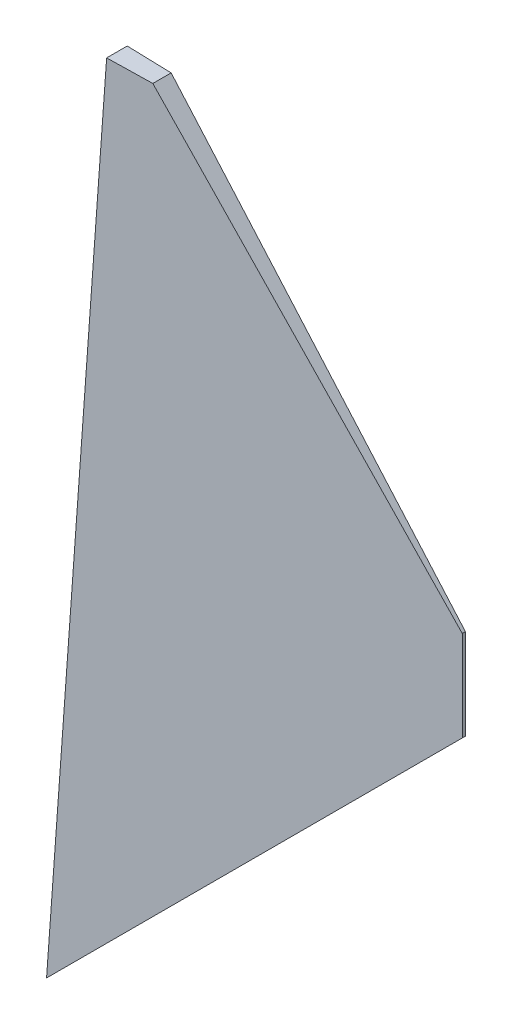
ISO-10303-21;
HEADER;
FILE_DESCRIPTION(('STEP AP214'),'2;1');
FILE_NAME('part.step','',(''),(''),'','','');
FILE_SCHEMA(('AUTOMOTIVE_DESIGN { 1 0 10303 214 1 1 1 1 }'));
ENDSEC;
DATA;
#1=APPLICATION_CONTEXT('core data for automotive mechanical design processes');
#2=APPLICATION_PROTOCOL_DEFINITION('international standard','automotive_design',2000,#1);
#3=PRODUCT_CONTEXT('',#1,'mechanical');
#4=PRODUCT('Part','Part','',(#3));
#5=PRODUCT_RELATED_PRODUCT_CATEGORY('part','',(#4));
#6=PRODUCT_DEFINITION_FORMATION('','',#4);
#7=PRODUCT_DEFINITION_CONTEXT('part definition',#1,'design');
#8=PRODUCT_DEFINITION('design','',#6,#7);
#9=PRODUCT_DEFINITION_SHAPE('','',#8);
#10=(LENGTH_UNIT() NAMED_UNIT(*) SI_UNIT(.MILLI.,.METRE.));
#11=(NAMED_UNIT(*) PLANE_ANGLE_UNIT() SI_UNIT($,.RADIAN.));
#12=(NAMED_UNIT(*) SI_UNIT($,.STERADIAN.) SOLID_ANGLE_UNIT());
#13=UNCERTAINTY_MEASURE_WITH_UNIT(LENGTH_MEASURE(1.E-05),#10,'distance_accuracy_value','');
#14=(GEOMETRIC_REPRESENTATION_CONTEXT(3) GLOBAL_UNCERTAINTY_ASSIGNED_CONTEXT((#13)) GLOBAL_UNIT_ASSIGNED_CONTEXT((#10,
#11,#12)) REPRESENTATION_CONTEXT('',''));
#15=CARTESIAN_POINT('',(0.,0.,0.));
#16=DIRECTION('',(0.,0.,1.));
#17=DIRECTION('',(1.,0.,0.));
#18=AXIS2_PLACEMENT_3D('',#15,#16,#17);
#19=CARTESIAN_POINT('',(228.6,508.,-0.888806717752921));
#20=DIRECTION('',(-0.0211064082934383,0.,-0.999777234952342));
#21=DIRECTION('',(-0.999777234952342,0.,0.0211064082934383));
#22=AXIS2_PLACEMENT_3D('',#19,#20,#21);
#23=PLANE('',#22);
#24=DIRECTION('',(0.678502784173109,-0.734458165175256,-0.0143239476658767));
#25=VECTOR('',#24,1.);
#26=CARTESIAN_POINT('',(114.681325389983,402.71342285535,1.51614307956966));
#27=LINE('',#26,#25);
#28=CARTESIAN_POINT('',(58.4369807585741,463.596176947233,2.70352368845496));
#29=VERTEX_POINT('',#28);
#30=CARTESIAN_POINT('',(228.6,279.400000000001,-0.88880671775292));
#31=VERTEX_POINT('',#30);
#32=EDGE_CURVE('E175',#29,#31,#27,.T.);
#33=ORIENTED_EDGE('',*,*,#32,.F.);
#34=DIRECTION('',(0.999777234952342,0.,-0.0211064082934383));
#35=VECTOR('',#34,1.);
#36=CARTESIAN_POINT('',(228.6,463.596176947233,-0.888806717752923));
#37=LINE('',#36,#35);
#38=CARTESIAN_POINT('',(33.0369807585741,463.596176947233,3.23974591067718));
#39=VERTEX_POINT('',#38);
#40=EDGE_CURVE('E150',#39,#29,#37,.T.);
#41=ORIENTED_EDGE('',*,*,#40,.F.);
#42=DIRECTION('',(0.0710820690227971,0.997469341683583,-0.00150062145714794));
#43=VECTOR('',#42,1.);
#44=CARTESIAN_POINT('',(37.1738627485292,521.647567570371,3.15241173533368));
#45=LINE('',#44,#43);
#46=CARTESIAN_POINT('',(0.,0.,3.93719328224708));
#47=VERTEX_POINT('',#46);
#48=EDGE_CURVE('E138',#47,#39,#45,.T.);
#49=ORIENTED_EDGE('',*,*,#48,.F.);
#50=DIRECTION('',(-0.707028008688555,-0.707028008688558,0.0149261468500917));
#51=VECTOR('',#50,1.);
#52=CARTESIAN_POINT('',(368.268876256587,368.268876256588,-3.83737188316975));
#53=LINE('',#52,#51);
#54=CARTESIAN_POINT('',(228.6,228.600000000001,-0.88880671775292));
#55=VERTEX_POINT('',#54);
#56=EDGE_CURVE('E144',#55,#47,#53,.T.);
#57=ORIENTED_EDGE('',*,*,#56,.F.);
#58=DIRECTION('',(0.,-1.,0.));
#59=VECTOR('',#58,1.);
#60=CARTESIAN_POINT('',(228.6,508.,-0.888806717752921));
#61=LINE('',#60,#59);
#62=EDGE_CURVE('E100',#31,#55,#61,.T.);
#63=ORIENTED_EDGE('',*,*,#62,.F.);
#64=EDGE_LOOP('',(#33,#41,#49,#57,#63));
#65=FACE_BOUND('',#64,.T.);
#66=ADVANCED_FACE('F86',(#65),#23,.F.);
#67=CARTESIAN_POINT('',(228.6,508.,-2.66680671775292));
#68=DIRECTION('',(-1.,0.,0.));
#69=DIRECTION('',(0.,0.,1.));
#70=AXIS2_PLACEMENT_3D('',#67,#68,#69);
#71=PLANE('',#70);
#72=DIRECTION('',(0.,0.,1.));
#73=VECTOR('',#72,1.);
#74=CARTESIAN_POINT('',(228.6,279.400000000001,-9.27080671775292));
#75=LINE('',#74,#73);
#76=CARTESIAN_POINT('',(228.6,279.400000000001,-2.66680671775292));
#77=VERTEX_POINT('',#76);
#78=EDGE_CURVE('E171',#77,#31,#75,.T.);
#79=ORIENTED_EDGE('',*,*,#78,.T.);
#80=ORIENTED_EDGE('',*,*,#62,.T.);
#81=DIRECTION('',(0.,0.,1.));
#82=VECTOR('',#81,1.);
#83=CARTESIAN_POINT('',(228.6,228.600000000001,-9.27080671775292));
#84=LINE('',#83,#82);
#85=CARTESIAN_POINT('',(228.6,228.600000000001,-2.66680671775292));
#86=VERTEX_POINT('',#85);
#87=EDGE_CURVE('E153',#86,#55,#84,.T.);
#88=ORIENTED_EDGE('',*,*,#87,.F.);
#89=DIRECTION('',(0.,-1.,0.));
#90=VECTOR('',#89,1.);
#91=CARTESIAN_POINT('',(228.6,508.,-2.66680671775292));
#92=LINE('',#91,#90);
#93=EDGE_CURVE('E108',#77,#86,#92,.T.);
#94=ORIENTED_EDGE('',*,*,#93,.F.);
#95=EDGE_LOOP('',(#79,#80,#88,#94));
#96=FACE_BOUND('',#95,.T.);
#97=ADVANCED_FACE('F178',(#96),#71,.F.);
#98=CARTESIAN_POINT('',(0.,508.,-9.27080671775292));
#99=DIRECTION('',(-0.028876841559416,0.,0.999582977056709));
#100=DIRECTION('',(0.999582977056709,0.,0.028876841559416));
#101=AXIS2_PLACEMENT_3D('',#98,#99,#100);
#102=PLANE('',#101);
#103=DIRECTION('',(-0.678442055732126,0.734392428526301,-0.0195994371655948));
#104=VECTOR('',#103,1.);
#105=CARTESIAN_POINT('',(9.39306659303715,516.684688964072,-8.99945146062074));
#106=LINE('',#105,#104);
#107=CARTESIAN_POINT('',(58.4369807585741,463.596176947233,-7.58262727361634));
#108=VERTEX_POINT('',#107);
#109=EDGE_CURVE('E12',#77,#108,#106,.T.);
#110=ORIENTED_EDGE('',*,*,#109,.F.);
#111=ORIENTED_EDGE('',*,*,#93,.T.);
#112=DIRECTION('',(0.706959295187016,0.706959295187019,0.0204232685276249));
#113=VECTOR('',#112,1.);
#114=CARTESIAN_POINT('',(253.894054086073,253.894054086074,-1.93608959971082));
#115=LINE('',#114,#113);
#116=CARTESIAN_POINT('',(0.,0.,-9.27080671775292));
#117=VERTEX_POINT('',#116);
#118=EDGE_CURVE('E154',#117,#86,#115,.T.);
#119=ORIENTED_EDGE('',*,*,#118,.F.);
#120=DIRECTION('',(-0.0710819991874846,-0.997468361709531,-0.00205347997652733));
#121=VECTOR('',#120,1.);
#122=CARTESIAN_POINT('',(36.0182390005019,505.43111136664,-8.23027981329398));
#123=LINE('',#122,#121);
#124=CARTESIAN_POINT('',(33.0369807585741,463.596176947233,-8.31640505139411));
#125=VERTEX_POINT('',#124);
#126=EDGE_CURVE('E141',#125,#117,#123,.T.);
#127=ORIENTED_EDGE('',*,*,#126,.F.);
#128=DIRECTION('',(-0.999582977056709,0.,-0.028876841559416));
#129=VECTOR('',#128,1.);
#130=CARTESIAN_POINT('',(0.,463.596176947233,-9.27080671775292));
#131=LINE('',#130,#129);
#132=EDGE_CURVE('E93',#108,#125,#131,.T.);
#133=ORIENTED_EDGE('',*,*,#132,.F.);
#134=EDGE_LOOP('',(#110,#111,#119,#127,#133));
#135=FACE_BOUND('',#134,.T.);
#136=ADVANCED_FACE('F168',(#135),#102,.F.);
#137=CARTESIAN_POINT('',(0.,0.,-9.27080671775292));
#138=DIRECTION('',(0.707106781186549,-0.707106781186546,0.));
#139=DIRECTION('',(0.707106781186546,0.707106781186549,0.));
#140=AXIS2_PLACEMENT_3D('',#137,#138,#139);
#141=PLANE('',#140);
#142=ORIENTED_EDGE('',*,*,#56,.T.);
#143=DIRECTION('',(0.,0.,1.));
#144=VECTOR('',#143,1.);
#145=CARTESIAN_POINT('',(0.,0.,3.93719328224708));
#146=LINE('',#145,#144);
#147=EDGE_CURVE('E134',#117,#47,#146,.T.);
#148=ORIENTED_EDGE('',*,*,#147,.F.);
#149=ORIENTED_EDGE('',*,*,#118,.T.);
#150=ORIENTED_EDGE('',*,*,#87,.T.);
#151=EDGE_LOOP('',(#142,#148,#149,#150));
#152=FACE_BOUND('',#151,.T.);
#153=ADVANCED_FACE('F152',(#152),#141,.T.);
#154=CARTESIAN_POINT('',(262.601237823977,242.594717356511,-9.27080671775292));
#155=DIRECTION('',(0.734533523173756,0.678572400952139,0.));
#156=DIRECTION('',(-0.678572400952139,0.734533523173756,0.));
#157=AXIS2_PLACEMENT_3D('',#154,#155,#156);
#158=PLANE('',#157);
#159=ORIENTED_EDGE('',*,*,#32,.T.);
#160=ORIENTED_EDGE('',*,*,#78,.F.);
#161=ORIENTED_EDGE('',*,*,#109,.T.);
#162=DIRECTION('',(0.,0.,1.));
#163=VECTOR('',#162,1.);
#164=CARTESIAN_POINT('',(58.4369807585741,463.596176947233,-9.27080671775292));
#165=LINE('',#164,#163);
#166=EDGE_CURVE('E166',#108,#29,#165,.T.);
#167=ORIENTED_EDGE('',*,*,#166,.T.);
#168=EDGE_LOOP('',(#159,#160,#161,#167));
#169=FACE_BOUND('',#168,.T.);
#170=ADVANCED_FACE('F177',(#169),#158,.T.);
#171=CARTESIAN_POINT('',(-1.01317942869098E-12,463.596176947233,-9.27080671775292));
#172=DIRECTION('',(0.,1.,0.));
#173=DIRECTION('',(-1.,0.,0.));
#174=AXIS2_PLACEMENT_3D('',#171,#172,#173);
#175=PLANE('',#174);
#176=ORIENTED_EDGE('',*,*,#40,.T.);
#177=ORIENTED_EDGE('',*,*,#166,.F.);
#178=ORIENTED_EDGE('',*,*,#132,.T.);
#179=DIRECTION('',(0.,0.,1.));
#180=VECTOR('',#179,1.);
#181=CARTESIAN_POINT('',(33.0369807585741,463.596176947233,-9.27080671775292));
#182=LINE('',#181,#180);
#183=EDGE_CURVE('E164',#125,#39,#182,.T.);
#184=ORIENTED_EDGE('',*,*,#183,.T.);
#185=EDGE_LOOP('',(#176,#177,#178,#184));
#186=FACE_BOUND('',#185,.T.);
#187=ADVANCED_FACE('F163',(#186),#175,.T.);
#188=CARTESIAN_POINT('',(0.,0.,-9.27080671775292));
#189=DIRECTION('',(-0.997470464768508,0.0710821490565353,0.));
#190=DIRECTION('',(-0.0710821490565353,-0.997470464768509,0.));
#191=AXIS2_PLACEMENT_3D('',#188,#189,#190);
#192=PLANE('',#191);
#193=ORIENTED_EDGE('',*,*,#48,.T.);
#194=ORIENTED_EDGE('',*,*,#183,.F.);
#195=ORIENTED_EDGE('',*,*,#126,.T.);
#196=ORIENTED_EDGE('',*,*,#147,.T.);
#197=EDGE_LOOP('',(#193,#194,#195,#196));
#198=FACE_BOUND('',#197,.T.);
#199=ADVANCED_FACE('F136',(#198),#192,.T.);
#200=CLOSED_SHELL('',(#66,#97,#136,#153,#170,#187,#199));
#201=MANIFOLD_SOLID_BREP('B2',#200);
#202=ADVANCED_BREP_SHAPE_REPRESENTATION('',(#18,#201),#14);
#203=SHAPE_DEFINITION_REPRESENTATION(#9,#202);
ENDSEC;
END-ISO-10303-21;
